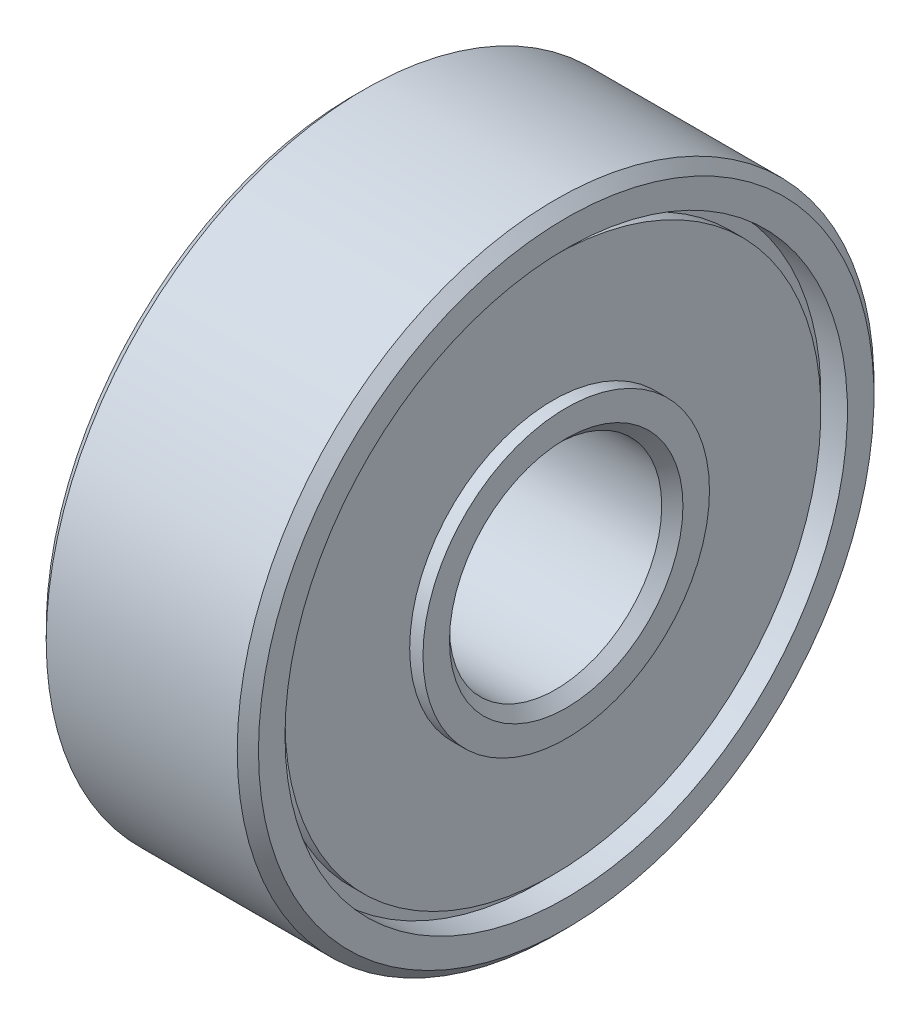
ISO-10303-21;
HEADER;
FILE_DESCRIPTION(('STEP AP214'),'2;1');
FILE_NAME('part.step','',(''),(''),'','','');
FILE_SCHEMA(('AUTOMOTIVE_DESIGN { 1 0 10303 214 1 1 1 1 }'));
ENDSEC;
DATA;
#1=APPLICATION_CONTEXT('core data for automotive mechanical design processes');
#2=APPLICATION_PROTOCOL_DEFINITION('international standard','automotive_design',2000,#1);
#3=PRODUCT_CONTEXT('',#1,'mechanical');
#4=PRODUCT('Part','Part','',(#3));
#5=PRODUCT_RELATED_PRODUCT_CATEGORY('part','',(#4));
#6=PRODUCT_DEFINITION_FORMATION('','',#4);
#7=PRODUCT_DEFINITION_CONTEXT('part definition',#1,'design');
#8=PRODUCT_DEFINITION('design','',#6,#7);
#9=PRODUCT_DEFINITION_SHAPE('','',#8);
#10=(LENGTH_UNIT() NAMED_UNIT(*) SI_UNIT(.MILLI.,.METRE.));
#11=(NAMED_UNIT(*) PLANE_ANGLE_UNIT() SI_UNIT($,.RADIAN.));
#12=(NAMED_UNIT(*) SI_UNIT($,.STERADIAN.) SOLID_ANGLE_UNIT());
#13=UNCERTAINTY_MEASURE_WITH_UNIT(LENGTH_MEASURE(1.E-05),#10,'distance_accuracy_value','');
#14=(GEOMETRIC_REPRESENTATION_CONTEXT(3) GLOBAL_UNCERTAINTY_ASSIGNED_CONTEXT((#13)) GLOBAL_UNIT_ASSIGNED_CONTEXT((#10,
#11,#12)) REPRESENTATION_CONTEXT('',''));
#15=CARTESIAN_POINT('',(0.,0.,0.));
#16=DIRECTION('',(0.,0.,1.));
#17=DIRECTION('',(1.,0.,0.));
#18=AXIS2_PLACEMENT_3D('',#15,#16,#17);
#19=CARTESIAN_POINT('',(-2.,5.3,0.));
#20=DIRECTION('',(1.,0.,0.));
#21=DIRECTION('',(0.,0.,-1.));
#22=AXIS2_PLACEMENT_3D('',#19,#20,#21);
#23=PLANE('',#22);
#24=CARTESIAN_POINT('',(-2.,0.,0.));
#25=DIRECTION('',(1.,0.,0.));
#26=DIRECTION('',(0.,0.,-1.));
#27=AXIS2_PLACEMENT_3D('',#24,#25,#26);
#28=CIRCLE('',#27,5.8);
#29=CARTESIAN_POINT('',(-2.,0.,-5.8));
#30=VERTEX_POINT('',#29);
#31=EDGE_CURVE('E10',#30,#30,#28,.F.);
#32=ORIENTED_EDGE('',*,*,#31,.T.);
#33=EDGE_LOOP('',(#32));
#34=FACE_BOUND('',#33,.T.);
#35=CARTESIAN_POINT('',(-2.,0.,0.));
#36=DIRECTION('',(-1.,0.,0.));
#37=DIRECTION('',(0.,0.,1.));
#38=AXIS2_PLACEMENT_3D('',#35,#36,#37);
#39=CIRCLE('',#38,5.3);
#40=CARTESIAN_POINT('',(-2.,0.,5.3));
#41=VERTEX_POINT('',#40);
#42=EDGE_CURVE('E68',#41,#41,#39,.T.);
#43=ORIENTED_EDGE('',*,*,#42,.F.);
#44=EDGE_LOOP('',(#43));
#45=FACE_BOUND('',#44,.T.);
#46=ADVANCED_FACE('F35',(#34,#45),#23,.F.);
#47=CARTESIAN_POINT('',(-3.90102380964335,0.,0.));
#48=DIRECTION('',(-1.,0.,0.));
#49=DIRECTION('',(0.,0.,1.));
#50=AXIS2_PLACEMENT_3D('',#47,#48,#49);
#51=CYLINDRICAL_SURFACE('',#50,5.3);
#52=CARTESIAN_POINT('',(-1.5,0.,0.));
#53=DIRECTION('',(-1.,0.,0.));
#54=DIRECTION('',(0.,0.,1.));
#55=AXIS2_PLACEMENT_3D('',#52,#53,#54);
#56=CIRCLE('',#55,5.3);
#57=CARTESIAN_POINT('',(-1.5,0.,5.3));
#58=VERTEX_POINT('',#57);
#59=EDGE_CURVE('E71',#58,#58,#56,.T.);
#60=ORIENTED_EDGE('',*,*,#59,.F.);
#61=EDGE_LOOP('',(#60));
#62=FACE_BOUND('',#61,.T.);
#63=ORIENTED_EDGE('',*,*,#42,.T.);
#64=EDGE_LOOP('',(#63));
#65=FACE_BOUND('',#64,.T.);
#66=ADVANCED_FACE('F149',(#62,#65),#51,.F.);
#67=CARTESIAN_POINT('',(-1.5,5.05,0.));
#68=DIRECTION('',(1.,0.,0.));
#69=DIRECTION('',(0.,0.,-1.));
#70=AXIS2_PLACEMENT_3D('',#67,#68,#69);
#71=PLANE('',#70);
#72=CARTESIAN_POINT('',(-1.5,0.,0.));
#73=DIRECTION('',(-1.,0.,0.));
#74=DIRECTION('',(0.,0.,1.));
#75=AXIS2_PLACEMENT_3D('',#72,#73,#74);
#76=CIRCLE('',#75,5.05);
#77=CARTESIAN_POINT('',(-1.5,0.,5.05));
#78=VERTEX_POINT('',#77);
#79=EDGE_CURVE('E74',#78,#78,#76,.T.);
#80=ORIENTED_EDGE('',*,*,#79,.F.);
#81=EDGE_LOOP('',(#80));
#82=FACE_BOUND('',#81,.T.);
#83=ORIENTED_EDGE('',*,*,#59,.T.);
#84=EDGE_LOOP('',(#83));
#85=FACE_BOUND('',#84,.T.);
#86=ADVANCED_FACE('F154',(#82,#85),#71,.F.);
#87=CARTESIAN_POINT('',(-3.90102380964335,0.,0.));
#88=DIRECTION('',(-1.,0.,0.));
#89=DIRECTION('',(0.,0.,1.));
#90=AXIS2_PLACEMENT_3D('',#87,#88,#89);
#91=CYLINDRICAL_SURFACE('',#90,5.05);
#92=CARTESIAN_POINT('',(-1.75,0.,0.));
#93=DIRECTION('',(-1.,0.,0.));
#94=DIRECTION('',(0.,0.,1.));
#95=AXIS2_PLACEMENT_3D('',#92,#93,#94);
#96=CIRCLE('',#95,5.05);
#97=CARTESIAN_POINT('',(-1.75,0.,5.05));
#98=VERTEX_POINT('',#97);
#99=EDGE_CURVE('E77',#98,#98,#96,.T.);
#100=ORIENTED_EDGE('',*,*,#99,.F.);
#101=EDGE_LOOP('',(#100));
#102=FACE_BOUND('',#101,.T.);
#103=ORIENTED_EDGE('',*,*,#79,.T.);
#104=EDGE_LOOP('',(#103));
#105=FACE_BOUND('',#104,.T.);
#106=ADVANCED_FACE('F241',(#102,#105),#91,.T.);
#107=CARTESIAN_POINT('',(-1.75,2.7,0.));
#108=DIRECTION('',(1.,0.,0.));
#109=DIRECTION('',(0.,0.,-1.));
#110=AXIS2_PLACEMENT_3D('',#107,#108,#109);
#111=PLANE('',#110);
#112=CARTESIAN_POINT('',(-1.75,0.,0.));
#113=DIRECTION('',(-1.,0.,0.));
#114=DIRECTION('',(0.,0.,1.));
#115=AXIS2_PLACEMENT_3D('',#112,#113,#114);
#116=CIRCLE('',#115,2.7);
#117=CARTESIAN_POINT('',(-1.75,0.,2.7));
#118=VERTEX_POINT('',#117);
#119=EDGE_CURVE('E80',#118,#118,#116,.T.);
#120=ORIENTED_EDGE('',*,*,#119,.F.);
#121=EDGE_LOOP('',(#120));
#122=FACE_BOUND('',#121,.T.);
#123=ORIENTED_EDGE('',*,*,#99,.T.);
#124=EDGE_LOOP('',(#123));
#125=FACE_BOUND('',#124,.T.);
#126=ADVANCED_FACE('F229',(#122,#125),#111,.F.);
#127=CARTESIAN_POINT('',(-3.90102380964335,0.,0.));
#128=DIRECTION('',(-1.,0.,0.));
#129=DIRECTION('',(0.,0.,1.));
#130=AXIS2_PLACEMENT_3D('',#127,#128,#129);
#131=CYLINDRICAL_SURFACE('',#130,2.7);
#132=CARTESIAN_POINT('',(-2.,0.,0.));
#133=DIRECTION('',(-1.,0.,0.));
#134=DIRECTION('',(0.,0.,1.));
#135=AXIS2_PLACEMENT_3D('',#132,#133,#134);
#136=CIRCLE('',#135,2.7);
#137=CARTESIAN_POINT('',(-2.,0.,2.7));
#138=VERTEX_POINT('',#137);
#139=EDGE_CURVE('E83',#138,#138,#136,.T.);
#140=ORIENTED_EDGE('',*,*,#139,.F.);
#141=EDGE_LOOP('',(#140));
#142=FACE_BOUND('',#141,.T.);
#143=ORIENTED_EDGE('',*,*,#119,.T.);
#144=EDGE_LOOP('',(#143));
#145=FACE_BOUND('',#144,.T.);
#146=ADVANCED_FACE('F224',(#142,#145),#131,.T.);
#147=CARTESIAN_POINT('',(-2.,2.,0.));
#148=DIRECTION('',(1.,0.,0.));
#149=DIRECTION('',(0.,0.,-1.));
#150=AXIS2_PLACEMENT_3D('',#147,#148,#149);
#151=PLANE('',#150);
#152=CARTESIAN_POINT('',(-2.,0.,0.));
#153=DIRECTION('',(1.,0.,0.));
#154=DIRECTION('',(0.,0.,-1.));
#155=AXIS2_PLACEMENT_3D('',#152,#153,#154);
#156=CIRCLE('',#155,2.2);
#157=CARTESIAN_POINT('',(-2.,0.,-2.2));
#158=VERTEX_POINT('',#157);
#159=EDGE_CURVE('E59',#158,#158,#156,.T.);
#160=ORIENTED_EDGE('',*,*,#159,.T.);
#161=EDGE_LOOP('',(#160));
#162=FACE_BOUND('',#161,.T.);
#163=ORIENTED_EDGE('',*,*,#139,.T.);
#164=EDGE_LOOP('',(#163));
#165=FACE_BOUND('',#164,.T.);
#166=ADVANCED_FACE('F145',(#162,#165),#151,.F.);
#167=CARTESIAN_POINT('',(-3.90102380964335,0.,0.));
#168=DIRECTION('',(-1.,0.,0.));
#169=DIRECTION('',(0.,0.,1.));
#170=AXIS2_PLACEMENT_3D('',#167,#168,#169);
#171=CYLINDRICAL_SURFACE('',#170,2.);
#172=CARTESIAN_POINT('',(-1.8,0.,0.));
#173=DIRECTION('',(1.,0.,0.));
#174=DIRECTION('',(0.,0.,-1.));
#175=AXIS2_PLACEMENT_3D('',#172,#173,#174);
#176=CIRCLE('',#175,2.);
#177=CARTESIAN_POINT('',(-1.8,0.,-2.));
#178=VERTEX_POINT('',#177);
#179=EDGE_CURVE('E62',#178,#178,#176,.F.);
#180=ORIENTED_EDGE('',*,*,#179,.T.);
#181=EDGE_LOOP('',(#180));
#182=FACE_BOUND('',#181,.T.);
#183=CARTESIAN_POINT('',(1.8,0.,0.));
#184=DIRECTION('',(-1.,0.,0.));
#185=DIRECTION('',(0.,0.,1.));
#186=AXIS2_PLACEMENT_3D('',#183,#184,#185);
#187=CIRCLE('',#186,2.);
#188=CARTESIAN_POINT('',(1.8,0.,2.));
#189=VERTEX_POINT('',#188);
#190=EDGE_CURVE('E65',#189,#189,#187,.F.);
#191=ORIENTED_EDGE('',*,*,#190,.T.);
#192=EDGE_LOOP('',(#191));
#193=FACE_BOUND('',#192,.T.);
#194=ADVANCED_FACE('F139',(#182,#193),#171,.F.);
#195=CARTESIAN_POINT('',(2.,2.,0.));
#196=DIRECTION('',(-1.,0.,0.));
#197=DIRECTION('',(0.,0.,1.));
#198=AXIS2_PLACEMENT_3D('',#195,#196,#197);
#199=PLANE('',#198);
#200=CARTESIAN_POINT('',(2.,0.,0.));
#201=DIRECTION('',(-1.,0.,0.));
#202=DIRECTION('',(0.,0.,1.));
#203=AXIS2_PLACEMENT_3D('',#200,#201,#202);
#204=CIRCLE('',#203,2.2);
#205=CARTESIAN_POINT('',(2.,0.,2.2));
#206=VERTEX_POINT('',#205);
#207=EDGE_CURVE('E56',#206,#206,#204,.T.);
#208=ORIENTED_EDGE('',*,*,#207,.T.);
#209=EDGE_LOOP('',(#208));
#210=FACE_BOUND('',#209,.T.);
#211=CARTESIAN_POINT('',(2.,0.,0.));
#212=DIRECTION('',(-1.,0.,0.));
#213=DIRECTION('',(0.,0.,1.));
#214=AXIS2_PLACEMENT_3D('',#211,#212,#213);
#215=CIRCLE('',#214,2.7);
#216=CARTESIAN_POINT('',(2.,0.,2.7));
#217=VERTEX_POINT('',#216);
#218=EDGE_CURVE('E86',#217,#217,#215,.T.);
#219=ORIENTED_EDGE('',*,*,#218,.F.);
#220=EDGE_LOOP('',(#219));
#221=FACE_BOUND('',#220,.T.);
#222=ADVANCED_FACE('F134',(#210,#221),#199,.F.);
#223=CARTESIAN_POINT('',(-3.90102380964335,0.,0.));
#224=DIRECTION('',(-1.,0.,0.));
#225=DIRECTION('',(0.,0.,1.));
#226=AXIS2_PLACEMENT_3D('',#223,#224,#225);
#227=CYLINDRICAL_SURFACE('',#226,2.7);
#228=CARTESIAN_POINT('',(1.75,0.,0.));
#229=DIRECTION('',(-1.,0.,0.));
#230=DIRECTION('',(0.,0.,1.));
#231=AXIS2_PLACEMENT_3D('',#228,#229,#230);
#232=CIRCLE('',#231,2.7);
#233=CARTESIAN_POINT('',(1.75,0.,2.7));
#234=VERTEX_POINT('',#233);
#235=EDGE_CURVE('E89',#234,#234,#232,.T.);
#236=ORIENTED_EDGE('',*,*,#235,.F.);
#237=EDGE_LOOP('',(#236));
#238=FACE_BOUND('',#237,.T.);
#239=ORIENTED_EDGE('',*,*,#218,.T.);
#240=EDGE_LOOP('',(#239));
#241=FACE_BOUND('',#240,.T.);
#242=ADVANCED_FACE('F128',(#238,#241),#227,.T.);
#243=CARTESIAN_POINT('',(1.75,2.7,0.));
#244=DIRECTION('',(-1.,0.,0.));
#245=DIRECTION('',(0.,0.,1.));
#246=AXIS2_PLACEMENT_3D('',#243,#244,#245);
#247=PLANE('',#246);
#248=CARTESIAN_POINT('',(1.75,0.,0.));
#249=DIRECTION('',(-1.,0.,0.));
#250=DIRECTION('',(0.,0.,1.));
#251=AXIS2_PLACEMENT_3D('',#248,#249,#250);
#252=CIRCLE('',#251,5.05);
#253=CARTESIAN_POINT('',(1.75,0.,5.05));
#254=VERTEX_POINT('',#253);
#255=EDGE_CURVE('E92',#254,#254,#252,.T.);
#256=ORIENTED_EDGE('',*,*,#255,.F.);
#257=EDGE_LOOP('',(#256));
#258=FACE_BOUND('',#257,.T.);
#259=ORIENTED_EDGE('',*,*,#235,.T.);
#260=EDGE_LOOP('',(#259));
#261=FACE_BOUND('',#260,.T.);
#262=ADVANCED_FACE('F122',(#258,#261),#247,.F.);
#263=CARTESIAN_POINT('',(-3.90102380964335,0.,0.));
#264=DIRECTION('',(-1.,0.,0.));
#265=DIRECTION('',(0.,0.,1.));
#266=AXIS2_PLACEMENT_3D('',#263,#264,#265);
#267=CYLINDRICAL_SURFACE('',#266,5.05);
#268=CARTESIAN_POINT('',(1.5,0.,0.));
#269=DIRECTION('',(-1.,0.,0.));
#270=DIRECTION('',(0.,0.,1.));
#271=AXIS2_PLACEMENT_3D('',#268,#269,#270);
#272=CIRCLE('',#271,5.05);
#273=CARTESIAN_POINT('',(1.5,0.,5.05));
#274=VERTEX_POINT('',#273);
#275=EDGE_CURVE('E95',#274,#274,#272,.T.);
#276=ORIENTED_EDGE('',*,*,#275,.F.);
#277=EDGE_LOOP('',(#276));
#278=FACE_BOUND('',#277,.T.);
#279=ORIENTED_EDGE('',*,*,#255,.T.);
#280=EDGE_LOOP('',(#279));
#281=FACE_BOUND('',#280,.T.);
#282=ADVANCED_FACE('F116',(#278,#281),#267,.T.);
#283=CARTESIAN_POINT('',(1.5,5.05,0.));
#284=DIRECTION('',(-1.,0.,0.));
#285=DIRECTION('',(0.,0.,1.));
#286=AXIS2_PLACEMENT_3D('',#283,#284,#285);
#287=PLANE('',#286);
#288=CARTESIAN_POINT('',(1.5,0.,0.));
#289=DIRECTION('',(-1.,0.,0.));
#290=DIRECTION('',(0.,0.,1.));
#291=AXIS2_PLACEMENT_3D('',#288,#289,#290);
#292=CIRCLE('',#291,5.3);
#293=CARTESIAN_POINT('',(1.5,0.,5.3));
#294=VERTEX_POINT('',#293);
#295=EDGE_CURVE('E98',#294,#294,#292,.T.);
#296=ORIENTED_EDGE('',*,*,#295,.F.);
#297=EDGE_LOOP('',(#296));
#298=FACE_BOUND('',#297,.T.);
#299=ORIENTED_EDGE('',*,*,#275,.T.);
#300=EDGE_LOOP('',(#299));
#301=FACE_BOUND('',#300,.T.);
#302=ADVANCED_FACE('F110',(#298,#301),#287,.F.);
#303=CARTESIAN_POINT('',(-3.90102380964335,0.,0.));
#304=DIRECTION('',(-1.,0.,0.));
#305=DIRECTION('',(0.,0.,1.));
#306=AXIS2_PLACEMENT_3D('',#303,#304,#305);
#307=CYLINDRICAL_SURFACE('',#306,5.3);
#308=CARTESIAN_POINT('',(2.,0.,0.));
#309=DIRECTION('',(-1.,0.,0.));
#310=DIRECTION('',(0.,0.,1.));
#311=AXIS2_PLACEMENT_3D('',#308,#309,#310);
#312=CIRCLE('',#311,5.3);
#313=CARTESIAN_POINT('',(2.,0.,5.3));
#314=VERTEX_POINT('',#313);
#315=EDGE_CURVE('E101',#314,#314,#312,.T.);
#316=ORIENTED_EDGE('',*,*,#315,.F.);
#317=EDGE_LOOP('',(#316));
#318=FACE_BOUND('',#317,.T.);
#319=ORIENTED_EDGE('',*,*,#295,.T.);
#320=EDGE_LOOP('',(#319));
#321=FACE_BOUND('',#320,.T.);
#322=ADVANCED_FACE('F107',(#318,#321),#307,.F.);
#323=CARTESIAN_POINT('',(2.,5.3,0.));
#324=DIRECTION('',(-1.,0.,0.));
#325=DIRECTION('',(0.,0.,1.));
#326=AXIS2_PLACEMENT_3D('',#323,#324,#325);
#327=PLANE('',#326);
#328=CARTESIAN_POINT('',(2.,0.,0.));
#329=DIRECTION('',(-1.,0.,0.));
#330=DIRECTION('',(0.,0.,1.));
#331=AXIS2_PLACEMENT_3D('',#328,#329,#330);
#332=CIRCLE('',#331,5.8);
#333=CARTESIAN_POINT('',(2.,0.,5.8));
#334=VERTEX_POINT('',#333);
#335=EDGE_CURVE('E43',#334,#334,#332,.F.);
#336=ORIENTED_EDGE('',*,*,#335,.T.);
#337=EDGE_LOOP('',(#336));
#338=FACE_BOUND('',#337,.T.);
#339=ORIENTED_EDGE('',*,*,#315,.T.);
#340=EDGE_LOOP('',(#339));
#341=FACE_BOUND('',#340,.T.);
#342=ADVANCED_FACE('F105',(#338,#341),#327,.F.);
#343=CARTESIAN_POINT('',(-3.90102380964335,0.,0.));
#344=DIRECTION('',(-1.,0.,0.));
#345=DIRECTION('',(0.,0.,1.));
#346=AXIS2_PLACEMENT_3D('',#343,#344,#345);
#347=CYLINDRICAL_SURFACE('',#346,6.);
#348=CARTESIAN_POINT('',(1.8,0.,0.));
#349=DIRECTION('',(-1.,0.,0.));
#350=DIRECTION('',(0.,0.,1.));
#351=AXIS2_PLACEMENT_3D('',#348,#349,#350);
#352=CIRCLE('',#351,6.);
#353=CARTESIAN_POINT('',(1.8,0.,6.));
#354=VERTEX_POINT('',#353);
#355=EDGE_CURVE('E47',#354,#354,#352,.T.);
#356=ORIENTED_EDGE('',*,*,#355,.T.);
#357=EDGE_LOOP('',(#356));
#358=FACE_BOUND('',#357,.T.);
#359=CARTESIAN_POINT('',(-1.79999999999999,0.,0.));
#360=DIRECTION('',(1.,0.,0.));
#361=DIRECTION('',(0.,0.,-1.));
#362=AXIS2_PLACEMENT_3D('',#359,#360,#361);
#363=CIRCLE('',#362,6.);
#364=CARTESIAN_POINT('',(-1.79999999999999,0.,-6.));
#365=VERTEX_POINT('',#364);
#366=EDGE_CURVE('E51',#365,#365,#363,.T.);
#367=ORIENTED_EDGE('',*,*,#366,.T.);
#368=EDGE_LOOP('',(#367));
#369=FACE_BOUND('',#368,.T.);
#370=ADVANCED_FACE('F168',(#358,#369),#347,.T.);
#371=CARTESIAN_POINT('',(-1.8,0.,0.));
#372=DIRECTION('',(-1.,0.,0.));
#373=DIRECTION('',(0.,0.,1.));
#374=AXIS2_PLACEMENT_3D('',#371,#372,#373);
#375=CONICAL_SURFACE('',#374,2.,0.785398163397448);
#376=ORIENTED_EDGE('',*,*,#159,.F.);
#377=EDGE_LOOP('',(#376));
#378=FACE_BOUND('',#377,.T.);
#379=ORIENTED_EDGE('',*,*,#179,.F.);
#380=EDGE_LOOP('',(#379));
#381=FACE_BOUND('',#380,.T.);
#382=ADVANCED_FACE('F161',(#378,#381),#375,.F.);
#383=CARTESIAN_POINT('',(2.,0.,0.));
#384=DIRECTION('',(1.,0.,0.));
#385=DIRECTION('',(0.,0.,-1.));
#386=AXIS2_PLACEMENT_3D('',#383,#384,#385);
#387=CONICAL_SURFACE('',#386,2.2,0.785398163397442);
#388=ORIENTED_EDGE('',*,*,#190,.F.);
#389=EDGE_LOOP('',(#388));
#390=FACE_BOUND('',#389,.T.);
#391=ORIENTED_EDGE('',*,*,#207,.F.);
#392=EDGE_LOOP('',(#391));
#393=FACE_BOUND('',#392,.T.);
#394=ADVANCED_FACE('F167',(#390,#393),#387,.F.);
#395=CARTESIAN_POINT('',(1.8,0.,0.));
#396=DIRECTION('',(-1.,0.,0.));
#397=DIRECTION('',(0.,0.,1.));
#398=AXIS2_PLACEMENT_3D('',#395,#396,#397);
#399=CONICAL_SURFACE('',#398,6.,0.785398163397448);
#400=ORIENTED_EDGE('',*,*,#335,.F.);
#401=EDGE_LOOP('',(#400));
#402=FACE_BOUND('',#401,.T.);
#403=ORIENTED_EDGE('',*,*,#355,.F.);
#404=EDGE_LOOP('',(#403));
#405=FACE_BOUND('',#404,.T.);
#406=ADVANCED_FACE('F174',(#402,#405),#399,.T.);
#407=CARTESIAN_POINT('',(-2.,0.,0.));
#408=DIRECTION('',(1.,0.,0.));
#409=DIRECTION('',(0.,0.,-1.));
#410=AXIS2_PLACEMENT_3D('',#407,#408,#409);
#411=CONICAL_SURFACE('',#410,5.8,0.785398163397442);
#412=CARTESIAN_POINT('',(-1.79999999999999,0.,-6.));
#413=CARTESIAN_POINT('',(-1.80208333333333,0.,-5.99791666666667));
#414=CARTESIAN_POINT('',(-1.80416666666666,0.,-5.99583333333333));
#415=CARTESIAN_POINT('',(-1.80833333333333,0.,-5.99166666666667));
#416=CARTESIAN_POINT('',(-1.81041666666666,0.,-5.98958333333333));
#417=CARTESIAN_POINT('',(-1.81458333333333,0.,-5.98541666666667));
#418=CARTESIAN_POINT('',(-1.81666666666666,0.,-5.98333333333333));
#419=CARTESIAN_POINT('',(-1.82083333333333,0.,-5.97916666666667));
#420=CARTESIAN_POINT('',(-1.82291666666666,0.,-5.97708333333333));
#421=CARTESIAN_POINT('',(-1.82708333333333,0.,-5.97291666666667));
#422=CARTESIAN_POINT('',(-1.82916666666666,0.,-5.97083333333333));
#423=CARTESIAN_POINT('',(-1.83333333333333,0.,-5.96666666666667));
#424=CARTESIAN_POINT('',(-1.83541666666666,0.,-5.96458333333333));
#425=CARTESIAN_POINT('',(-1.83958333333333,0.,-5.96041666666667));
#426=CARTESIAN_POINT('',(-1.84166666666666,0.,-5.95833333333333));
#427=CARTESIAN_POINT('',(-1.84583333333333,0.,-5.95416666666667));
#428=CARTESIAN_POINT('',(-1.84791666666666,0.,-5.95208333333333));
#429=CARTESIAN_POINT('',(-1.85208333333333,0.,-5.94791666666667));
#430=CARTESIAN_POINT('',(-1.85416666666666,0.,-5.94583333333333));
#431=CARTESIAN_POINT('',(-1.85833333333333,0.,-5.94166666666667));
#432=CARTESIAN_POINT('',(-1.86041666666666,0.,-5.93958333333333));
#433=CARTESIAN_POINT('',(-1.86458333333333,0.,-5.93541666666667));
#434=CARTESIAN_POINT('',(-1.86666666666666,0.,-5.93333333333333));
#435=CARTESIAN_POINT('',(-1.87083333333333,0.,-5.92916666666667));
#436=CARTESIAN_POINT('',(-1.87291666666666,0.,-5.92708333333333));
#437=CARTESIAN_POINT('',(-1.87708333333333,0.,-5.92291666666667));
#438=CARTESIAN_POINT('',(-1.87916666666666,0.,-5.92083333333333));
#439=CARTESIAN_POINT('',(-1.88333333333333,0.,-5.91666666666667));
#440=CARTESIAN_POINT('',(-1.88541666666666,0.,-5.91458333333333));
#441=CARTESIAN_POINT('',(-1.88958333333333,0.,-5.91041666666667));
#442=CARTESIAN_POINT('',(-1.89166666666666,0.,-5.90833333333333));
#443=CARTESIAN_POINT('',(-1.89583333333333,0.,-5.90416666666667));
#444=CARTESIAN_POINT('',(-1.89791666666666,0.,-5.90208333333333));
#445=CARTESIAN_POINT('',(-1.90208333333333,0.,-5.89791666666667));
#446=CARTESIAN_POINT('',(-1.90416666666666,0.,-5.89583333333333));
#447=CARTESIAN_POINT('',(-1.90833333333333,0.,-5.89166666666667));
#448=CARTESIAN_POINT('',(-1.91041666666666,0.,-5.88958333333333));
#449=CARTESIAN_POINT('',(-1.91458333333333,0.,-5.88541666666667));
#450=CARTESIAN_POINT('',(-1.91666666666666,0.,-5.88333333333333));
#451=CARTESIAN_POINT('',(-1.92083333333333,0.,-5.87916666666667));
#452=CARTESIAN_POINT('',(-1.92291666666666,0.,-5.87708333333333));
#453=CARTESIAN_POINT('',(-1.92708333333333,0.,-5.87291666666667));
#454=CARTESIAN_POINT('',(-1.92916666666666,0.,-5.87083333333333));
#455=CARTESIAN_POINT('',(-1.93333333333333,0.,-5.86666666666667));
#456=CARTESIAN_POINT('',(-1.93541666666666,0.,-5.86458333333333));
#457=CARTESIAN_POINT('',(-1.93958333333333,0.,-5.86041666666667));
#458=CARTESIAN_POINT('',(-1.94166666666666,0.,-5.85833333333333));
#459=CARTESIAN_POINT('',(-1.94583333333333,0.,-5.85416666666667));
#460=CARTESIAN_POINT('',(-1.94791666666666,0.,-5.85208333333333));
#461=CARTESIAN_POINT('',(-1.95208333333333,0.,-5.84791666666667));
#462=CARTESIAN_POINT('',(-1.95416666666666,0.,-5.84583333333333));
#463=CARTESIAN_POINT('',(-1.95833333333333,0.,-5.84166666666667));
#464=CARTESIAN_POINT('',(-1.96041666666666,0.,-5.83958333333333));
#465=CARTESIAN_POINT('',(-1.96458333333333,0.,-5.83541666666667));
#466=CARTESIAN_POINT('',(-1.96666666666667,0.,-5.83333333333333));
#467=CARTESIAN_POINT('',(-1.97083333333333,0.,-5.82916666666666));
#468=CARTESIAN_POINT('',(-1.97291666666667,0.,-5.82708333333333));
#469=CARTESIAN_POINT('',(-1.97708333333333,0.,-5.82291666666666));
#470=CARTESIAN_POINT('',(-1.97916666666667,0.,-5.82083333333333));
#471=CARTESIAN_POINT('',(-1.98333333333333,0.,-5.81666666666666));
#472=CARTESIAN_POINT('',(-1.98541666666667,0.,-5.81458333333333));
#473=CARTESIAN_POINT('',(-1.98958333333333,0.,-5.81041666666667));
#474=CARTESIAN_POINT('',(-1.99166666666667,0.,-5.80833333333333));
#475=CARTESIAN_POINT('',(-1.99583333333333,0.,-5.80416666666667));
#476=CARTESIAN_POINT('',(-1.99791666666667,0.,-5.80208333333333));
#477=CARTESIAN_POINT('',(-2.,0.,-5.8));
#478=B_SPLINE_CURVE_WITH_KNOTS('',3,(#412,#413,#414,#415,#416,#417,#418,#419,#420,#421,#422,
#423,#424,#425,#426,#427,#428,#429,#430,#431,#432,#433,#434,#435,#436,#437,#438,#439,#440,#441,
#442,#443,#444,#445,#446,#447,#448,#449,#450,#451,#452,#453,#454,#455,#456,#457,#458,#459,#460,
#461,#462,#463,#464,#465,#466,#467,#468,#469,#470,#471,#472,#473,#474,#475,#476,#477),
.UNSPECIFIED.,.F.,.F.,(4,2,2,2,2,2,2,2,2,2,2,2,2,2,2,2,2,2,2,2,2,2,2,2,2,2,2,2,2,2,2,2,4),(0.,
0.00883883476483194,0.017677669529664,0.0265165042944961,0.0353553390593282,0.0441941738241603,
0.0530330085889918,0.0618718433538239,0.070710678118656,0.0795495128834881,0.0883883476483202,
0.0972271824131521,0.106066017177984,0.114904851942816,0.123743686707648,0.13258252147248,
0.141421356237312,0.150260191002144,0.159099025766976,0.167937860531808,0.17677669529664,
0.185615530061472,0.194454364826304,0.203293199591136,0.212132034355968,0.2209708691208,
0.229809703885632,0.238648538650464,0.247487373415296,0.256326208180128,0.26516504294496,
0.274003877709792,0.282842712474624),.UNSPECIFIED.);
#479=EDGE_CURVE('BSEAM38',#365,#30,#478,.T.);
#480=ORIENTED_EDGE('',*,*,#366,.F.);
#481=ORIENTED_EDGE('',*,*,#31,.F.);
#482=ORIENTED_EDGE('',*,*,#479,.T.);
#483=ORIENTED_EDGE('',*,*,#479,.F.);
#484=EDGE_LOOP('',(#480,#482,#481,#483));
#485=FACE_BOUND('',#484,.T.);
#486=ADVANCED_FACE('F38',(#485),#411,.T.);
#487=CLOSED_SHELL('',(#46,#66,#86,#106,#126,#146,#166,#194,#222,#242,#262,#282,#302,#322,#342,
#370,#382,#394,#406,#486));
#488=MANIFOLD_SOLID_BREP('B2',#487);
#489=ADVANCED_BREP_SHAPE_REPRESENTATION('',(#18,#488),#14);
#490=SHAPE_DEFINITION_REPRESENTATION(#9,#489);
ENDSEC;
END-ISO-10303-21;
